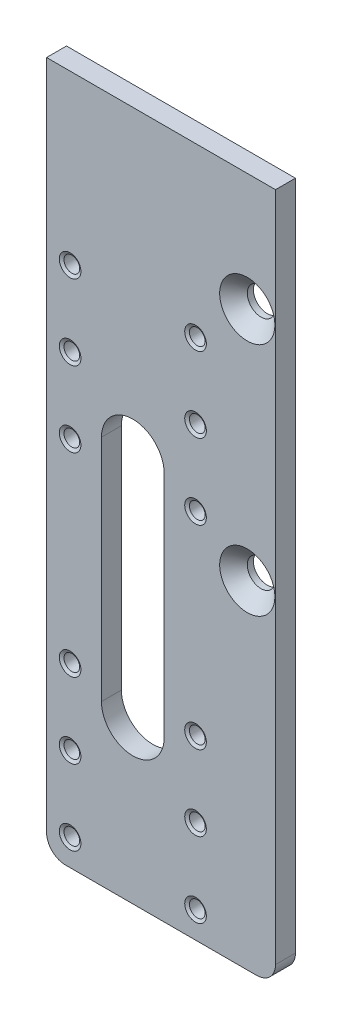
ISO-10303-21;
HEADER;
FILE_DESCRIPTION(('STEP AP214'),'2;1');
FILE_NAME('part.step','',(''),(''),'','','');
FILE_SCHEMA(('AUTOMOTIVE_DESIGN { 1 0 10303 214 1 1 1 1 }'));
ENDSEC;
DATA;
#1=APPLICATION_CONTEXT('core data for automotive mechanical design processes');
#2=APPLICATION_PROTOCOL_DEFINITION('international standard','automotive_design',2000,#1);
#3=PRODUCT_CONTEXT('',#1,'mechanical');
#4=PRODUCT('Part','Part','',(#3));
#5=PRODUCT_RELATED_PRODUCT_CATEGORY('part','',(#4));
#6=PRODUCT_DEFINITION_FORMATION('','',#4);
#7=PRODUCT_DEFINITION_CONTEXT('part definition',#1,'design');
#8=PRODUCT_DEFINITION('design','',#6,#7);
#9=PRODUCT_DEFINITION_SHAPE('','',#8);
#10=(LENGTH_UNIT() NAMED_UNIT(*) SI_UNIT(.MILLI.,.METRE.));
#11=(NAMED_UNIT(*) PLANE_ANGLE_UNIT() SI_UNIT($,.RADIAN.));
#12=(NAMED_UNIT(*) SI_UNIT($,.STERADIAN.) SOLID_ANGLE_UNIT());
#13=UNCERTAINTY_MEASURE_WITH_UNIT(LENGTH_MEASURE(1.E-05),#10,'distance_accuracy_value','');
#14=(GEOMETRIC_REPRESENTATION_CONTEXT(3) GLOBAL_UNCERTAINTY_ASSIGNED_CONTEXT((#13)) GLOBAL_UNIT_ASSIGNED_CONTEXT((#10,
#11,#12)) REPRESENTATION_CONTEXT('',''));
#15=CARTESIAN_POINT('',(0.,0.,0.));
#16=DIRECTION('',(0.,0.,1.));
#17=DIRECTION('',(1.,0.,0.));
#18=AXIS2_PLACEMENT_3D('',#15,#16,#17);
#19=CARTESIAN_POINT('',(-565.816847611489,-465.810072168843,246.750729330131));
#20=DIRECTION('',(0.,0.,1.));
#21=DIRECTION('',(1.,0.,0.));
#22=AXIS2_PLACEMENT_3D('',#19,#20,#21);
#23=CONICAL_SURFACE('',#22,3.44999999985629,1.04719755119663);
#24=CARTESIAN_POINT('',(-565.816847611489,-465.810072168843,246.750729330173));
#25=DIRECTION('',(0.,0.,1.));
#26=DIRECTION('',(1.,0.,0.));
#27=AXIS2_PLACEMENT_3D('',#24,#25,#26);
#28=CIRCLE('',#27,3.44999999992979);
#29=CARTESIAN_POINT('',(-562.366847611559,-465.810072168843,246.750729330173));
#30=VERTEX_POINT('',#29);
#31=EDGE_CURVE('E315',#30,#30,#28,.T.);
#32=ORIENTED_EDGE('',*,*,#31,.T.);
#33=EDGE_LOOP('',(#32));
#34=FACE_BOUND('',#33,.T.);
#35=CARTESIAN_POINT('',(-565.816847611489,-465.810072168843,246.202246574448));
#36=DIRECTION('',(0.,0.,1.));
#37=DIRECTION('',(0.,-1.,0.));
#38=AXIS2_PLACEMENT_3D('',#35,#36,#37);
#39=CIRCLE('',#38,2.5);
#40=CARTESIAN_POINT('',(-565.816847611489,-468.310072168843,246.202246574448));
#41=VERTEX_POINT('',#40);
#42=EDGE_CURVE('E207',#41,#41,#39,.F.);
#43=ORIENTED_EDGE('',*,*,#42,.T.);
#44=EDGE_LOOP('',(#43));
#45=FACE_BOUND('',#44,.T.);
#46=ADVANCED_FACE('F17',(#34,#45),#23,.F.);
#47=CARTESIAN_POINT('',(-525.816847611489,-465.810072168843,246.750729330188));
#48=DIRECTION('',(0.,0.,1.));
#49=DIRECTION('',(0.,-1.,0.));
#50=AXIS2_PLACEMENT_3D('',#47,#48,#49);
#51=CONICAL_SURFACE('',#50,3.44999999994955,1.04719755119663);
#52=CARTESIAN_POINT('',(-525.816847611489,-465.810072168843,246.750729330242));
#53=DIRECTION('',(0.,0.,1.));
#54=DIRECTION('',(0.,-1.,0.));
#55=AXIS2_PLACEMENT_3D('',#52,#53,#54);
#56=CIRCLE('',#55,3.45000000004347);
#57=CARTESIAN_POINT('',(-525.816847611489,-469.260072168886,246.750729330242));
#58=VERTEX_POINT('',#57);
#59=EDGE_CURVE('E323',#58,#58,#56,.T.);
#60=ORIENTED_EDGE('',*,*,#59,.T.);
#61=EDGE_LOOP('',(#60));
#62=FACE_BOUND('',#61,.T.);
#63=CARTESIAN_POINT('',(-525.816847611489,-465.810072168843,246.202246574448));
#64=DIRECTION('',(0.,0.,1.));
#65=DIRECTION('',(0.,-1.,0.));
#66=AXIS2_PLACEMENT_3D('',#63,#64,#65);
#67=CIRCLE('',#66,2.5);
#68=CARTESIAN_POINT('',(-525.816847611489,-468.310072168843,246.202246574448));
#69=VERTEX_POINT('',#68);
#70=EDGE_CURVE('E203',#69,#69,#67,.F.);
#71=ORIENTED_EDGE('',*,*,#70,.T.);
#72=EDGE_LOOP('',(#71));
#73=FACE_BOUND('',#72,.T.);
#74=ADVANCED_FACE('F467',(#62,#73),#51,.F.);
#75=CARTESIAN_POINT('',(-525.816847611489,-489.810072168843,246.750729330188));
#76=DIRECTION('',(0.,0.,1.));
#77=DIRECTION('',(0.,-1.,0.));
#78=AXIS2_PLACEMENT_3D('',#75,#76,#77);
#79=CONICAL_SURFACE('',#78,3.44999999994955,1.04719755119663);
#80=CARTESIAN_POINT('',(-525.816847611489,-489.810072168843,246.750729330242));
#81=DIRECTION('',(0.,0.,1.));
#82=DIRECTION('',(0.,-1.,0.));
#83=AXIS2_PLACEMENT_3D('',#80,#81,#82);
#84=CIRCLE('',#83,3.45000000004347);
#85=CARTESIAN_POINT('',(-525.816847611489,-493.260072168886,246.750729330242));
#86=VERTEX_POINT('',#85);
#87=EDGE_CURVE('E331',#86,#86,#84,.T.);
#88=ORIENTED_EDGE('',*,*,#87,.T.);
#89=EDGE_LOOP('',(#88));
#90=FACE_BOUND('',#89,.T.);
#91=CARTESIAN_POINT('',(-525.816847611489,-489.810072168843,246.202246574448));
#92=DIRECTION('',(0.,0.,1.));
#93=DIRECTION('',(0.,-1.,0.));
#94=AXIS2_PLACEMENT_3D('',#91,#92,#93);
#95=CIRCLE('',#94,2.5);
#96=CARTESIAN_POINT('',(-525.816847611489,-492.310072168843,246.202246574448));
#97=VERTEX_POINT('',#96);
#98=EDGE_CURVE('E199',#97,#97,#95,.F.);
#99=ORIENTED_EDGE('',*,*,#98,.T.);
#100=EDGE_LOOP('',(#99));
#101=FACE_BOUND('',#100,.T.);
#102=ADVANCED_FACE('F471',(#90,#101),#79,.F.);
#103=CARTESIAN_POINT('',(-525.816847611489,-355.810072168843,246.750729330188));
#104=DIRECTION('',(0.,0.,1.));
#105=DIRECTION('',(0.,-1.,0.));
#106=AXIS2_PLACEMENT_3D('',#103,#104,#105);
#107=CONICAL_SURFACE('',#106,3.44999999994955,1.04719755119663);
#108=CARTESIAN_POINT('',(-525.816847611489,-355.810072168843,246.750729330242));
#109=DIRECTION('',(0.,0.,1.));
#110=DIRECTION('',(0.,-1.,0.));
#111=AXIS2_PLACEMENT_3D('',#108,#109,#110);
#112=CIRCLE('',#111,3.45000000004347);
#113=CARTESIAN_POINT('',(-525.816847611489,-359.260072168886,246.750729330242));
#114=VERTEX_POINT('',#113);
#115=EDGE_CURVE('E20',#114,#114,#112,.T.);
#116=ORIENTED_EDGE('',*,*,#115,.T.);
#117=EDGE_LOOP('',(#116));
#118=FACE_BOUND('',#117,.T.);
#119=CARTESIAN_POINT('',(-525.816847611489,-355.810072168843,246.202246574448));
#120=DIRECTION('',(0.,0.,1.));
#121=DIRECTION('',(0.,-1.,0.));
#122=AXIS2_PLACEMENT_3D('',#119,#120,#121);
#123=CIRCLE('',#122,2.5);
#124=CARTESIAN_POINT('',(-525.816847611489,-358.310072168843,246.202246574448));
#125=VERTEX_POINT('',#124);
#126=EDGE_CURVE('E195',#125,#125,#123,.F.);
#127=ORIENTED_EDGE('',*,*,#126,.T.);
#128=EDGE_LOOP('',(#127));
#129=FACE_BOUND('',#128,.T.);
#130=ADVANCED_FACE('F345',(#118,#129),#107,.F.);
#131=CARTESIAN_POINT('',(-525.816847611489,-379.810072168843,246.750729330188));
#132=DIRECTION('',(0.,0.,1.));
#133=DIRECTION('',(0.,-1.,0.));
#134=AXIS2_PLACEMENT_3D('',#131,#132,#133);
#135=CONICAL_SURFACE('',#134,3.44999999994955,1.04719755119663);
#136=CARTESIAN_POINT('',(-525.816847611489,-379.810072168843,246.750729330242));
#137=DIRECTION('',(0.,0.,1.));
#138=DIRECTION('',(0.,-1.,0.));
#139=AXIS2_PLACEMENT_3D('',#136,#137,#138);
#140=CIRCLE('',#139,3.45000000004347);
#141=CARTESIAN_POINT('',(-525.816847611489,-383.260072168886,246.750729330242));
#142=VERTEX_POINT('',#141);
#143=EDGE_CURVE('E303',#142,#142,#140,.T.);
#144=ORIENTED_EDGE('',*,*,#143,.T.);
#145=EDGE_LOOP('',(#144));
#146=FACE_BOUND('',#145,.T.);
#147=CARTESIAN_POINT('',(-525.816847611489,-379.810072168843,246.202246574448));
#148=DIRECTION('',(0.,0.,1.));
#149=DIRECTION('',(0.,-1.,0.));
#150=AXIS2_PLACEMENT_3D('',#147,#148,#149);
#151=CIRCLE('',#150,2.5);
#152=CARTESIAN_POINT('',(-525.816847611489,-382.310072168843,246.202246574448));
#153=VERTEX_POINT('',#152);
#154=EDGE_CURVE('E191',#153,#153,#151,.F.);
#155=ORIENTED_EDGE('',*,*,#154,.T.);
#156=EDGE_LOOP('',(#155));
#157=FACE_BOUND('',#156,.T.);
#158=ADVANCED_FACE('F497',(#146,#157),#135,.F.);
#159=CARTESIAN_POINT('',(-525.816847611489,-403.810072168843,246.750729330188));
#160=DIRECTION('',(0.,0.,1.));
#161=DIRECTION('',(0.,-1.,0.));
#162=AXIS2_PLACEMENT_3D('',#159,#160,#161);
#163=CONICAL_SURFACE('',#162,3.44999999994955,1.04719755119663);
#164=CARTESIAN_POINT('',(-525.816847611489,-403.810072168843,246.750729330242));
#165=DIRECTION('',(0.,0.,1.));
#166=DIRECTION('',(0.,-1.,0.));
#167=AXIS2_PLACEMENT_3D('',#164,#165,#166);
#168=CIRCLE('',#167,3.45000000004347);
#169=CARTESIAN_POINT('',(-525.816847611489,-407.260072168886,246.750729330242));
#170=VERTEX_POINT('',#169);
#171=EDGE_CURVE('E319',#170,#170,#168,.T.);
#172=ORIENTED_EDGE('',*,*,#171,.T.);
#173=EDGE_LOOP('',(#172));
#174=FACE_BOUND('',#173,.T.);
#175=CARTESIAN_POINT('',(-525.816847611489,-403.810072168843,246.202246574448));
#176=DIRECTION('',(0.,0.,1.));
#177=DIRECTION('',(0.,-1.,0.));
#178=AXIS2_PLACEMENT_3D('',#175,#176,#177);
#179=CIRCLE('',#178,2.5);
#180=CARTESIAN_POINT('',(-525.816847611489,-406.310072168843,246.202246574448));
#181=VERTEX_POINT('',#180);
#182=EDGE_CURVE('E187',#181,#181,#179,.F.);
#183=ORIENTED_EDGE('',*,*,#182,.T.);
#184=EDGE_LOOP('',(#183));
#185=FACE_BOUND('',#184,.T.);
#186=ADVANCED_FACE('F502',(#174,#185),#163,.F.);
#187=CARTESIAN_POINT('',(-565.816847611489,-355.810072168843,246.750729330131));
#188=DIRECTION('',(0.,0.,1.));
#189=DIRECTION('',(1.,0.,0.));
#190=AXIS2_PLACEMENT_3D('',#187,#188,#189);
#191=CONICAL_SURFACE('',#190,3.44999999985629,1.04719755119663);
#192=CARTESIAN_POINT('',(-565.816847611489,-355.810072168843,246.750729330173));
#193=DIRECTION('',(0.,0.,1.));
#194=DIRECTION('',(1.,0.,0.));
#195=AXIS2_PLACEMENT_3D('',#192,#193,#194);
#196=CIRCLE('',#195,3.44999999992979);
#197=CARTESIAN_POINT('',(-562.366847611559,-355.810072168843,246.750729330173));
#198=VERTEX_POINT('',#197);
#199=EDGE_CURVE('E334',#198,#198,#196,.T.);
#200=ORIENTED_EDGE('',*,*,#199,.T.);
#201=EDGE_LOOP('',(#200));
#202=FACE_BOUND('',#201,.T.);
#203=CARTESIAN_POINT('',(-565.816847611489,-355.810072168843,246.202246574448));
#204=DIRECTION('',(0.,0.,1.));
#205=DIRECTION('',(0.,-1.,0.));
#206=AXIS2_PLACEMENT_3D('',#203,#204,#205);
#207=CIRCLE('',#206,2.5);
#208=CARTESIAN_POINT('',(-565.816847611489,-358.310072168843,246.202246574448));
#209=VERTEX_POINT('',#208);
#210=EDGE_CURVE('E183',#209,#209,#207,.F.);
#211=ORIENTED_EDGE('',*,*,#210,.T.);
#212=EDGE_LOOP('',(#211));
#213=FACE_BOUND('',#212,.T.);
#214=ADVANCED_FACE('F506',(#202,#213),#191,.F.);
#215=CARTESIAN_POINT('',(-565.816847611489,-379.810072168843,246.750729330131));
#216=DIRECTION('',(0.,0.,1.));
#217=DIRECTION('',(1.,0.,0.));
#218=AXIS2_PLACEMENT_3D('',#215,#216,#217);
#219=CONICAL_SURFACE('',#218,3.44999999985629,1.04719755119663);
#220=CARTESIAN_POINT('',(-565.816847611489,-379.810072168843,246.750729330173));
#221=DIRECTION('',(0.,0.,1.));
#222=DIRECTION('',(1.,0.,0.));
#223=AXIS2_PLACEMENT_3D('',#220,#221,#222);
#224=CIRCLE('',#223,3.44999999992979);
#225=CARTESIAN_POINT('',(-562.366847611559,-379.810072168843,246.750729330173));
#226=VERTEX_POINT('',#225);
#227=EDGE_CURVE('E311',#226,#226,#224,.T.);
#228=ORIENTED_EDGE('',*,*,#227,.T.);
#229=EDGE_LOOP('',(#228));
#230=FACE_BOUND('',#229,.T.);
#231=CARTESIAN_POINT('',(-565.816847611489,-379.810072168843,246.202246574448));
#232=DIRECTION('',(0.,0.,1.));
#233=DIRECTION('',(0.,-1.,0.));
#234=AXIS2_PLACEMENT_3D('',#231,#232,#233);
#235=CIRCLE('',#234,2.5);
#236=CARTESIAN_POINT('',(-565.816847611489,-382.310072168843,246.202246574448));
#237=VERTEX_POINT('',#236);
#238=EDGE_CURVE('E179',#237,#237,#235,.F.);
#239=ORIENTED_EDGE('',*,*,#238,.T.);
#240=EDGE_LOOP('',(#239));
#241=FACE_BOUND('',#240,.T.);
#242=ADVANCED_FACE('F510',(#230,#241),#219,.F.);
#243=CARTESIAN_POINT('',(-565.816847611489,-403.810072168843,246.750729330131));
#244=DIRECTION('',(0.,0.,1.));
#245=DIRECTION('',(1.,0.,0.));
#246=AXIS2_PLACEMENT_3D('',#243,#244,#245);
#247=CONICAL_SURFACE('',#246,3.44999999985629,1.04719755119663);
#248=CARTESIAN_POINT('',(-565.816847611489,-403.810072168843,246.750729330173));
#249=DIRECTION('',(0.,0.,1.));
#250=DIRECTION('',(1.,0.,0.));
#251=AXIS2_PLACEMENT_3D('',#248,#249,#250);
#252=CIRCLE('',#251,3.44999999992979);
#253=CARTESIAN_POINT('',(-562.366847611559,-403.810072168843,246.750729330173));
#254=VERTEX_POINT('',#253);
#255=EDGE_CURVE('E327',#254,#254,#252,.T.);
#256=ORIENTED_EDGE('',*,*,#255,.T.);
#257=EDGE_LOOP('',(#256));
#258=FACE_BOUND('',#257,.T.);
#259=CARTESIAN_POINT('',(-565.816847611489,-403.810072168843,246.202246574448));
#260=DIRECTION('',(0.,0.,1.));
#261=DIRECTION('',(0.,-1.,0.));
#262=AXIS2_PLACEMENT_3D('',#259,#260,#261);
#263=CIRCLE('',#262,2.5);
#264=CARTESIAN_POINT('',(-565.816847611489,-406.310072168843,246.202246574448));
#265=VERTEX_POINT('',#264);
#266=EDGE_CURVE('E100',#265,#265,#263,.F.);
#267=ORIENTED_EDGE('',*,*,#266,.T.);
#268=EDGE_LOOP('',(#267));
#269=FACE_BOUND('',#268,.T.);
#270=ADVANCED_FACE('F513',(#258,#269),#247,.F.);
#271=CARTESIAN_POINT('',(-565.816847611489,-513.810072168843,246.750729330131));
#272=DIRECTION('',(0.,0.,1.));
#273=DIRECTION('',(1.,0.,0.));
#274=AXIS2_PLACEMENT_3D('',#271,#272,#273);
#275=CONICAL_SURFACE('',#274,3.44999999985629,1.04719755119663);
#276=CARTESIAN_POINT('',(-565.816847611489,-513.810072168843,246.750729330173));
#277=DIRECTION('',(0.,0.,1.));
#278=DIRECTION('',(1.,0.,0.));
#279=AXIS2_PLACEMENT_3D('',#276,#277,#278);
#280=CIRCLE('',#279,3.44999999992979);
#281=CARTESIAN_POINT('',(-562.366847611559,-513.810072168843,246.750729330173));
#282=VERTEX_POINT('',#281);
#283=EDGE_CURVE('E291',#282,#282,#280,.T.);
#284=ORIENTED_EDGE('',*,*,#283,.T.);
#285=EDGE_LOOP('',(#284));
#286=FACE_BOUND('',#285,.T.);
#287=CARTESIAN_POINT('',(-565.816847611489,-513.810072168843,246.202246574448));
#288=DIRECTION('',(0.,0.,1.));
#289=DIRECTION('',(0.,-1.,0.));
#290=AXIS2_PLACEMENT_3D('',#287,#288,#289);
#291=CIRCLE('',#290,2.5);
#292=CARTESIAN_POINT('',(-565.816847611489,-516.310072168843,246.202246574448));
#293=VERTEX_POINT('',#292);
#294=EDGE_CURVE('E169',#293,#293,#291,.F.);
#295=ORIENTED_EDGE('',*,*,#294,.T.);
#296=EDGE_LOOP('',(#295));
#297=FACE_BOUND('',#296,.T.);
#298=ADVANCED_FACE('F517',(#286,#297),#275,.F.);
#299=CARTESIAN_POINT('',(-525.816847611489,-513.810072168843,246.750729330188));
#300=DIRECTION('',(0.,0.,1.));
#301=DIRECTION('',(0.,-1.,0.));
#302=AXIS2_PLACEMENT_3D('',#299,#300,#301);
#303=CONICAL_SURFACE('',#302,3.44999999994955,1.04719755119663);
#304=CARTESIAN_POINT('',(-525.816847611489,-513.810072168843,246.750729330242));
#305=DIRECTION('',(0.,0.,1.));
#306=DIRECTION('',(0.,-1.,0.));
#307=AXIS2_PLACEMENT_3D('',#304,#305,#306);
#308=CIRCLE('',#307,3.45000000004347);
#309=CARTESIAN_POINT('',(-525.816847611489,-517.260072168886,246.750729330242));
#310=VERTEX_POINT('',#309);
#311=EDGE_CURVE('E295',#310,#310,#308,.T.);
#312=ORIENTED_EDGE('',*,*,#311,.T.);
#313=EDGE_LOOP('',(#312));
#314=FACE_BOUND('',#313,.T.);
#315=CARTESIAN_POINT('',(-525.816847611489,-513.810072168843,246.202246574448));
#316=DIRECTION('',(0.,0.,1.));
#317=DIRECTION('',(0.,-1.,0.));
#318=AXIS2_PLACEMENT_3D('',#315,#316,#317);
#319=CIRCLE('',#318,2.5);
#320=CARTESIAN_POINT('',(-525.816847611489,-516.310072168843,246.202246574448));
#321=VERTEX_POINT('',#320);
#322=EDGE_CURVE('E165',#321,#321,#319,.F.);
#323=ORIENTED_EDGE('',*,*,#322,.T.);
#324=EDGE_LOOP('',(#323));
#325=FACE_BOUND('',#324,.T.);
#326=ADVANCED_FACE('F521',(#314,#325),#303,.F.);
#327=CARTESIAN_POINT('',(-509.316847611489,-339.701572168842,246.750729330131));
#328=DIRECTION('',(0.,0.,1.));
#329=DIRECTION('',(1.,0.,0.));
#330=AXIS2_PLACEMENT_3D('',#327,#328,#329);
#331=CONICAL_SURFACE('',#330,8.79999999990633,0.785398163397448);
#332=CARTESIAN_POINT('',(-509.316847611489,-339.701572168842,246.750729330188));
#333=DIRECTION('',(0.,0.,1.));
#334=DIRECTION('',(1.,0.,0.));
#335=AXIS2_PLACEMENT_3D('',#332,#333,#334);
#336=CIRCLE('',#335,8.79999999996317);
#337=CARTESIAN_POINT('',(-500.516847611526,-339.701572168842,246.750729330188));
#338=VERTEX_POINT('',#337);
#339=EDGE_CURVE('E299',#338,#338,#336,.T.);
#340=ORIENTED_EDGE('',*,*,#339,.T.);
#341=EDGE_LOOP('',(#340));
#342=FACE_BOUND('',#341,.T.);
#343=CARTESIAN_POINT('',(-509.316847611489,-339.701572168842,242.350729330178));
#344=DIRECTION('',(0.,0.,1.));
#345=DIRECTION('',(0.,-1.,0.));
#346=AXIS2_PLACEMENT_3D('',#343,#344,#345);
#347=CIRCLE('',#346,4.4);
#348=CARTESIAN_POINT('',(-509.316847611489,-344.101572168842,242.350729330178));
#349=VERTEX_POINT('',#348);
#350=EDGE_CURVE('E161',#349,#349,#347,.F.);
#351=ORIENTED_EDGE('',*,*,#350,.T.);
#352=EDGE_LOOP('',(#351));
#353=FACE_BOUND('',#352,.T.);
#354=ADVANCED_FACE('F359',(#342,#353),#331,.F.);
#355=CARTESIAN_POINT('',(-565.816847611489,-489.810072168843,246.750729330131));
#356=DIRECTION('',(0.,0.,1.));
#357=DIRECTION('',(1.,0.,0.));
#358=AXIS2_PLACEMENT_3D('',#355,#356,#357);
#359=CONICAL_SURFACE('',#358,3.44999999985629,1.04719755119663);
#360=CARTESIAN_POINT('',(-565.816847611489,-489.810072168843,246.750729330173));
#361=DIRECTION('',(0.,0.,1.));
#362=DIRECTION('',(1.,0.,0.));
#363=AXIS2_PLACEMENT_3D('',#360,#361,#362);
#364=CIRCLE('',#363,3.44999999992979);
#365=CARTESIAN_POINT('',(-562.366847611559,-489.810072168843,246.750729330173));
#366=VERTEX_POINT('',#365);
#367=EDGE_CURVE('E307',#366,#366,#364,.T.);
#368=ORIENTED_EDGE('',*,*,#367,.T.);
#369=EDGE_LOOP('',(#368));
#370=FACE_BOUND('',#369,.T.);
#371=CARTESIAN_POINT('',(-565.816847611489,-489.810072168843,246.202246574448));
#372=DIRECTION('',(0.,0.,1.));
#373=DIRECTION('',(0.,-1.,0.));
#374=AXIS2_PLACEMENT_3D('',#371,#372,#373);
#375=CIRCLE('',#374,2.5);
#376=CARTESIAN_POINT('',(-565.816847611489,-492.310072168843,246.202246574448));
#377=VERTEX_POINT('',#376);
#378=EDGE_CURVE('E142',#377,#377,#375,.F.);
#379=ORIENTED_EDGE('',*,*,#378,.T.);
#380=EDGE_LOOP('',(#379));
#381=FACE_BOUND('',#380,.T.);
#382=ADVANCED_FACE('F349',(#370,#381),#359,.F.);
#383=CARTESIAN_POINT('',(-564.566847611488,-458.810072168843,246.750729330178));
#384=DIRECTION('',(0.,0.,-1.));
#385=DIRECTION('',(0.,1.,0.));
#386=AXIS2_PLACEMENT_3D('',#383,#384,#385);
#387=PLANE('',#386);
#388=DIRECTION('',(-1.,0.,0.));
#389=VECTOR('',#388,1.);
#390=CARTESIAN_POINT('',(-588.489347611488,-302.201572168842,246.750729330178));
#391=LINE('',#390,#389);
#392=CARTESIAN_POINT('',(-573.316847611489,-302.201572168842,246.750729330178));
#393=VERTEX_POINT('',#392);
#394=CARTESIAN_POINT('',(-500.316847611489,-302.201572168842,246.750729330178));
#395=VERTEX_POINT('',#394);
#396=EDGE_CURVE('E143',#393,#395,#391,.F.);
#397=ORIENTED_EDGE('',*,*,#396,.F.);
#398=DIRECTION('',(0.,1.,0.));
#399=VECTOR('',#398,1.);
#400=CARTESIAN_POINT('',(-573.316847611489,-346.310072168843,246.750729330178));
#401=LINE('',#400,#399);
#402=CARTESIAN_POINT('',(-573.316847611489,-516.201572168843,246.750729330178));
#403=VERTEX_POINT('',#402);
#404=EDGE_CURVE('E151',#403,#393,#401,.T.);
#405=ORIENTED_EDGE('',*,*,#404,.F.);
#406=CARTESIAN_POINT('',(-567.316847611489,-516.201572168843,246.750729330178));
#407=DIRECTION('',(0.,0.,1.));
#408=DIRECTION('',(1.,0.,0.));
#409=AXIS2_PLACEMENT_3D('',#406,#407,#408);
#410=CIRCLE('',#409,6.);
#411=CARTESIAN_POINT('',(-567.316847611489,-522.201572168843,246.750729330178));
#412=VERTEX_POINT('',#411);
#413=EDGE_CURVE('E155',#412,#403,#410,.F.);
#414=ORIENTED_EDGE('',*,*,#413,.F.);
#415=DIRECTION('',(-1.,0.,0.));
#416=VECTOR('',#415,1.);
#417=CARTESIAN_POINT('',(-588.489347611488,-522.201572168843,246.750729330178));
#418=LINE('',#417,#416);
#419=CARTESIAN_POINT('',(-506.316847611489,-522.201572168843,246.750729330178));
#420=VERTEX_POINT('',#419);
#421=EDGE_CURVE('E138',#412,#420,#418,.F.);
#422=ORIENTED_EDGE('',*,*,#421,.T.);
#423=CARTESIAN_POINT('',(-506.316847611489,-516.201572168843,246.750729330178));
#424=DIRECTION('',(0.,0.,1.));
#425=DIRECTION('',(1.,0.,0.));
#426=AXIS2_PLACEMENT_3D('',#423,#424,#425);
#427=CIRCLE('',#426,6.);
#428=CARTESIAN_POINT('',(-500.316847611489,-516.201572168843,246.750729330178));
#429=VERTEX_POINT('',#428);
#430=EDGE_CURVE('E129',#429,#420,#427,.F.);
#431=ORIENTED_EDGE('',*,*,#430,.F.);
#432=DIRECTION('',(0.,-1.,0.));
#433=VECTOR('',#432,1.);
#434=CARTESIAN_POINT('',(-500.316847611489,-398.310072168843,246.750729330178));
#435=LINE('',#434,#433);
#436=EDGE_CURVE('E130',#429,#395,#435,.F.);
#437=ORIENTED_EDGE('',*,*,#436,.T.);
#438=EDGE_LOOP('',(#397,#405,#414,#422,#431,#437));
#439=FACE_BOUND('',#438,.T.);
#440=ORIENTED_EDGE('',*,*,#283,.F.);
#441=EDGE_LOOP('',(#440));
#442=FACE_BOUND('',#441,.T.);
#443=CARTESIAN_POINT('',(-509.316847611489,-414.701572168842,246.750729330188));
#444=DIRECTION('',(0.,0.,1.));
#445=DIRECTION('',(1.,0.,0.));
#446=AXIS2_PLACEMENT_3D('',#443,#444,#445);
#447=CIRCLE('',#446,8.79999999996317);
#448=CARTESIAN_POINT('',(-500.516847611526,-414.701572168842,246.750729330188));
#449=VERTEX_POINT('',#448);
#450=EDGE_CURVE('E210',#449,#449,#447,.F.);
#451=ORIENTED_EDGE('',*,*,#450,.T.);
#452=EDGE_LOOP('',(#451));
#453=FACE_BOUND('',#452,.T.);
#454=ORIENTED_EDGE('',*,*,#311,.F.);
#455=EDGE_LOOP('',(#454));
#456=FACE_BOUND('',#455,.T.);
#457=ORIENTED_EDGE('',*,*,#339,.F.);
#458=EDGE_LOOP('',(#457));
#459=FACE_BOUND('',#458,.T.);
#460=ORIENTED_EDGE('',*,*,#143,.F.);
#461=EDGE_LOOP('',(#460));
#462=FACE_BOUND('',#461,.T.);
#463=ORIENTED_EDGE('',*,*,#367,.F.);
#464=EDGE_LOOP('',(#463));
#465=FACE_BOUND('',#464,.T.);
#466=ORIENTED_EDGE('',*,*,#227,.F.);
#467=EDGE_LOOP('',(#466));
#468=FACE_BOUND('',#467,.T.);
#469=ORIENTED_EDGE('',*,*,#31,.F.);
#470=EDGE_LOOP('',(#469));
#471=FACE_BOUND('',#470,.T.);
#472=ORIENTED_EDGE('',*,*,#171,.F.);
#473=EDGE_LOOP('',(#472));
#474=FACE_BOUND('',#473,.T.);
#475=ORIENTED_EDGE('',*,*,#59,.F.);
#476=EDGE_LOOP('',(#475));
#477=FACE_BOUND('',#476,.T.);
#478=ORIENTED_EDGE('',*,*,#255,.F.);
#479=EDGE_LOOP('',(#478));
#480=FACE_BOUND('',#479,.T.);
#481=ORIENTED_EDGE('',*,*,#87,.F.);
#482=EDGE_LOOP('',(#481));
#483=FACE_BOUND('',#482,.T.);
#484=ORIENTED_EDGE('',*,*,#199,.F.);
#485=EDGE_LOOP('',(#484));
#486=FACE_BOUND('',#485,.T.);
#487=CARTESIAN_POINT('',(-545.816847611489,-398.310072168843,246.750729330178));
#488=DIRECTION('',(0.,0.,1.));
#489=DIRECTION('',(0.,-1.,0.));
#490=AXIS2_PLACEMENT_3D('',#487,#488,#489);
#491=CIRCLE('',#490,10.);
#492=CARTESIAN_POINT('',(-555.816847611489,-398.310072168843,246.750729330178));
#493=VERTEX_POINT('',#492);
#494=CARTESIAN_POINT('',(-535.816847611489,-398.310072168843,246.750729330178));
#495=VERTEX_POINT('',#494);
#496=EDGE_CURVE('E88',#493,#495,#491,.F.);
#497=ORIENTED_EDGE('',*,*,#496,.T.);
#498=DIRECTION('',(0.,1.,0.));
#499=VECTOR('',#498,1.);
#500=CARTESIAN_POINT('',(-535.816847611489,-398.310072168843,246.750729330178));
#501=LINE('',#500,#499);
#502=CARTESIAN_POINT('',(-535.816847611489,-471.310072168843,246.750729330178));
#503=VERTEX_POINT('',#502);
#504=EDGE_CURVE('E173',#495,#503,#501,.F.);
#505=ORIENTED_EDGE('',*,*,#504,.T.);
#506=CARTESIAN_POINT('',(-545.816847611489,-471.310072168843,246.750729330178));
#507=DIRECTION('',(0.,0.,1.));
#508=DIRECTION('',(0.,-1.,0.));
#509=AXIS2_PLACEMENT_3D('',#506,#507,#508);
#510=CIRCLE('',#509,10.);
#511=CARTESIAN_POINT('',(-555.816847611489,-471.310072168843,246.750729330178));
#512=VERTEX_POINT('',#511);
#513=EDGE_CURVE('E106',#503,#512,#510,.F.);
#514=ORIENTED_EDGE('',*,*,#513,.T.);
#515=DIRECTION('',(0.,1.,0.));
#516=VECTOR('',#515,1.);
#517=CARTESIAN_POINT('',(-555.816847611489,-471.310072168843,246.750729330178));
#518=LINE('',#517,#516);
#519=EDGE_CURVE('E103',#512,#493,#518,.T.);
#520=ORIENTED_EDGE('',*,*,#519,.T.);
#521=EDGE_LOOP('',(#497,#505,#514,#520));
#522=FACE_BOUND('',#521,.T.);
#523=ORIENTED_EDGE('',*,*,#115,.F.);
#524=EDGE_LOOP('',(#523));
#525=FACE_BOUND('',#524,.T.);
#526=ADVANCED_FACE('F104',(#439,#442,#453,#456,#459,#462,#465,#468,#471,#474,#477,#480,#483,
#486,#522,#525),#387,.F.);
#527=CARTESIAN_POINT('',(-509.316847611489,-414.701572168842,246.750729330131));
#528=DIRECTION('',(0.,0.,1.));
#529=DIRECTION('',(1.,0.,0.));
#530=AXIS2_PLACEMENT_3D('',#527,#528,#529);
#531=CONICAL_SURFACE('',#530,8.79999999990633,0.785398163397448);
#532=ORIENTED_EDGE('',*,*,#450,.F.);
#533=EDGE_LOOP('',(#532));
#534=FACE_BOUND('',#533,.T.);
#535=CARTESIAN_POINT('',(-509.316847611489,-414.701572168842,242.350729330178));
#536=DIRECTION('',(0.,0.,1.));
#537=DIRECTION('',(0.,-1.,0.));
#538=AXIS2_PLACEMENT_3D('',#535,#536,#537);
#539=CIRCLE('',#538,4.4);
#540=CARTESIAN_POINT('',(-509.316847611489,-419.101572168842,242.350729330178));
#541=VERTEX_POINT('',#540);
#542=EDGE_CURVE('E124',#541,#541,#539,.F.);
#543=ORIENTED_EDGE('',*,*,#542,.T.);
#544=EDGE_LOOP('',(#543));
#545=FACE_BOUND('',#544,.T.);
#546=ADVANCED_FACE('F348',(#534,#545),#531,.F.);
#547=CARTESIAN_POINT('',(-565.816847611489,-465.810072168843,246.750729330178));
#548=DIRECTION('',(0.,0.,1.));
#549=DIRECTION('',(0.,-1.,0.));
#550=AXIS2_PLACEMENT_3D('',#547,#548,#549);
#551=CYLINDRICAL_SURFACE('',#550,2.5);
#552=ORIENTED_EDGE('',*,*,#42,.F.);
#553=EDGE_LOOP('',(#552));
#554=FACE_BOUND('',#553,.T.);
#555=CARTESIAN_POINT('',(-565.816847611489,-465.810072168843,240.400729330178));
#556=DIRECTION('',(0.,0.,1.));
#557=DIRECTION('',(0.,-1.,0.));
#558=AXIS2_PLACEMENT_3D('',#555,#556,#557);
#559=CIRCLE('',#558,2.5);
#560=CARTESIAN_POINT('',(-565.816847611489,-468.310072168843,240.400729330178));
#561=VERTEX_POINT('',#560);
#562=EDGE_CURVE('E128',#561,#561,#559,.T.);
#563=ORIENTED_EDGE('',*,*,#562,.F.);
#564=EDGE_LOOP('',(#563));
#565=FACE_BOUND('',#564,.T.);
#566=ADVANCED_FACE('F356',(#554,#565),#551,.F.);
#567=CARTESIAN_POINT('',(-525.816847611489,-465.810072168843,246.750729330178));
#568=DIRECTION('',(0.,0.,1.));
#569=DIRECTION('',(0.,-1.,0.));
#570=AXIS2_PLACEMENT_3D('',#567,#568,#569);
#571=CYLINDRICAL_SURFACE('',#570,2.5);
#572=ORIENTED_EDGE('',*,*,#70,.F.);
#573=EDGE_LOOP('',(#572));
#574=FACE_BOUND('',#573,.T.);
#575=CARTESIAN_POINT('',(-525.816847611489,-465.810072168843,240.400729330178));
#576=DIRECTION('',(0.,0.,1.));
#577=DIRECTION('',(0.,-1.,0.));
#578=AXIS2_PLACEMENT_3D('',#575,#576,#577);
#579=CIRCLE('',#578,2.5);
#580=CARTESIAN_POINT('',(-525.816847611489,-468.310072168843,240.400729330178));
#581=VERTEX_POINT('',#580);
#582=EDGE_CURVE('E273',#581,#581,#579,.T.);
#583=ORIENTED_EDGE('',*,*,#582,.F.);
#584=EDGE_LOOP('',(#583));
#585=FACE_BOUND('',#584,.T.);
#586=ADVANCED_FACE('F453',(#574,#585),#571,.F.);
#587=CARTESIAN_POINT('',(-525.816847611489,-489.810072168843,246.750729330178));
#588=DIRECTION('',(0.,0.,1.));
#589=DIRECTION('',(0.,-1.,0.));
#590=AXIS2_PLACEMENT_3D('',#587,#588,#589);
#591=CYLINDRICAL_SURFACE('',#590,2.5);
#592=ORIENTED_EDGE('',*,*,#98,.F.);
#593=EDGE_LOOP('',(#592));
#594=FACE_BOUND('',#593,.T.);
#595=CARTESIAN_POINT('',(-525.816847611489,-489.810072168843,240.400729330178));
#596=DIRECTION('',(0.,0.,1.));
#597=DIRECTION('',(0.,-1.,0.));
#598=AXIS2_PLACEMENT_3D('',#595,#596,#597);
#599=CIRCLE('',#598,2.5);
#600=CARTESIAN_POINT('',(-525.816847611489,-492.310072168843,240.400729330178));
#601=VERTEX_POINT('',#600);
#602=EDGE_CURVE('E269',#601,#601,#599,.T.);
#603=ORIENTED_EDGE('',*,*,#602,.F.);
#604=EDGE_LOOP('',(#603));
#605=FACE_BOUND('',#604,.T.);
#606=ADVANCED_FACE('F449',(#594,#605),#591,.F.);
#607=CARTESIAN_POINT('',(-525.816847611489,-355.810072168843,246.750729330178));
#608=DIRECTION('',(0.,0.,1.));
#609=DIRECTION('',(0.,-1.,0.));
#610=AXIS2_PLACEMENT_3D('',#607,#608,#609);
#611=CYLINDRICAL_SURFACE('',#610,2.5);
#612=ORIENTED_EDGE('',*,*,#126,.F.);
#613=EDGE_LOOP('',(#612));
#614=FACE_BOUND('',#613,.T.);
#615=CARTESIAN_POINT('',(-525.816847611489,-355.810072168843,240.400729330178));
#616=DIRECTION('',(0.,0.,1.));
#617=DIRECTION('',(0.,-1.,0.));
#618=AXIS2_PLACEMENT_3D('',#615,#616,#617);
#619=CIRCLE('',#618,2.5);
#620=CARTESIAN_POINT('',(-525.816847611489,-358.310072168843,240.400729330178));
#621=VERTEX_POINT('',#620);
#622=EDGE_CURVE('E265',#621,#621,#619,.T.);
#623=ORIENTED_EDGE('',*,*,#622,.F.);
#624=EDGE_LOOP('',(#623));
#625=FACE_BOUND('',#624,.T.);
#626=ADVANCED_FACE('F445',(#614,#625),#611,.F.);
#627=CARTESIAN_POINT('',(-525.816847611489,-379.810072168843,246.750729330178));
#628=DIRECTION('',(0.,0.,1.));
#629=DIRECTION('',(0.,-1.,0.));
#630=AXIS2_PLACEMENT_3D('',#627,#628,#629);
#631=CYLINDRICAL_SURFACE('',#630,2.5);
#632=ORIENTED_EDGE('',*,*,#154,.F.);
#633=EDGE_LOOP('',(#632));
#634=FACE_BOUND('',#633,.T.);
#635=CARTESIAN_POINT('',(-525.816847611489,-379.810072168843,240.400729330178));
#636=DIRECTION('',(0.,0.,1.));
#637=DIRECTION('',(0.,-1.,0.));
#638=AXIS2_PLACEMENT_3D('',#635,#636,#637);
#639=CIRCLE('',#638,2.5);
#640=CARTESIAN_POINT('',(-525.816847611489,-382.310072168843,240.400729330178));
#641=VERTEX_POINT('',#640);
#642=EDGE_CURVE('E261',#641,#641,#639,.T.);
#643=ORIENTED_EDGE('',*,*,#642,.F.);
#644=EDGE_LOOP('',(#643));
#645=FACE_BOUND('',#644,.T.);
#646=ADVANCED_FACE('F441',(#634,#645),#631,.F.);
#647=CARTESIAN_POINT('',(-525.816847611489,-403.810072168843,246.750729330178));
#648=DIRECTION('',(0.,0.,1.));
#649=DIRECTION('',(0.,-1.,0.));
#650=AXIS2_PLACEMENT_3D('',#647,#648,#649);
#651=CYLINDRICAL_SURFACE('',#650,2.5);
#652=ORIENTED_EDGE('',*,*,#182,.F.);
#653=EDGE_LOOP('',(#652));
#654=FACE_BOUND('',#653,.T.);
#655=CARTESIAN_POINT('',(-525.816847611489,-403.810072168843,240.400729330178));
#656=DIRECTION('',(0.,0.,1.));
#657=DIRECTION('',(0.,-1.,0.));
#658=AXIS2_PLACEMENT_3D('',#655,#656,#657);
#659=CIRCLE('',#658,2.5);
#660=CARTESIAN_POINT('',(-525.816847611489,-406.310072168843,240.400729330178));
#661=VERTEX_POINT('',#660);
#662=EDGE_CURVE('E257',#661,#661,#659,.T.);
#663=ORIENTED_EDGE('',*,*,#662,.F.);
#664=EDGE_LOOP('',(#663));
#665=FACE_BOUND('',#664,.T.);
#666=ADVANCED_FACE('F437',(#654,#665),#651,.F.);
#667=CARTESIAN_POINT('',(-565.816847611489,-355.810072168843,246.750729330178));
#668=DIRECTION('',(0.,0.,1.));
#669=DIRECTION('',(0.,-1.,0.));
#670=AXIS2_PLACEMENT_3D('',#667,#668,#669);
#671=CYLINDRICAL_SURFACE('',#670,2.5);
#672=ORIENTED_EDGE('',*,*,#210,.F.);
#673=EDGE_LOOP('',(#672));
#674=FACE_BOUND('',#673,.T.);
#675=CARTESIAN_POINT('',(-565.816847611489,-355.810072168843,240.400729330178));
#676=DIRECTION('',(0.,0.,1.));
#677=DIRECTION('',(0.,-1.,0.));
#678=AXIS2_PLACEMENT_3D('',#675,#676,#677);
#679=CIRCLE('',#678,2.5);
#680=CARTESIAN_POINT('',(-565.816847611489,-358.310072168843,240.400729330178));
#681=VERTEX_POINT('',#680);
#682=EDGE_CURVE('E253',#681,#681,#679,.T.);
#683=ORIENTED_EDGE('',*,*,#682,.F.);
#684=EDGE_LOOP('',(#683));
#685=FACE_BOUND('',#684,.T.);
#686=ADVANCED_FACE('F433',(#674,#685),#671,.F.);
#687=CARTESIAN_POINT('',(-565.816847611489,-379.810072168843,246.750729330178));
#688=DIRECTION('',(0.,0.,1.));
#689=DIRECTION('',(0.,-1.,0.));
#690=AXIS2_PLACEMENT_3D('',#687,#688,#689);
#691=CYLINDRICAL_SURFACE('',#690,2.5);
#692=ORIENTED_EDGE('',*,*,#238,.F.);
#693=EDGE_LOOP('',(#692));
#694=FACE_BOUND('',#693,.T.);
#695=CARTESIAN_POINT('',(-565.816847611489,-379.810072168843,240.400729330178));
#696=DIRECTION('',(0.,0.,1.));
#697=DIRECTION('',(0.,-1.,0.));
#698=AXIS2_PLACEMENT_3D('',#695,#696,#697);
#699=CIRCLE('',#698,2.5);
#700=CARTESIAN_POINT('',(-565.816847611489,-382.310072168843,240.400729330178));
#701=VERTEX_POINT('',#700);
#702=EDGE_CURVE('E249',#701,#701,#699,.T.);
#703=ORIENTED_EDGE('',*,*,#702,.F.);
#704=EDGE_LOOP('',(#703));
#705=FACE_BOUND('',#704,.T.);
#706=ADVANCED_FACE('F429',(#694,#705),#691,.F.);
#707=CARTESIAN_POINT('',(-565.816847611489,-403.810072168843,246.750729330178));
#708=DIRECTION('',(0.,0.,1.));
#709=DIRECTION('',(0.,-1.,0.));
#710=AXIS2_PLACEMENT_3D('',#707,#708,#709);
#711=CYLINDRICAL_SURFACE('',#710,2.5);
#712=ORIENTED_EDGE('',*,*,#266,.F.);
#713=EDGE_LOOP('',(#712));
#714=FACE_BOUND('',#713,.T.);
#715=CARTESIAN_POINT('',(-565.816847611489,-403.810072168843,240.400729330178));
#716=DIRECTION('',(0.,0.,1.));
#717=DIRECTION('',(0.,-1.,0.));
#718=AXIS2_PLACEMENT_3D('',#715,#716,#717);
#719=CIRCLE('',#718,2.5);
#720=CARTESIAN_POINT('',(-565.816847611489,-406.310072168843,240.400729330178));
#721=VERTEX_POINT('',#720);
#722=EDGE_CURVE('E245',#721,#721,#719,.T.);
#723=ORIENTED_EDGE('',*,*,#722,.F.);
#724=EDGE_LOOP('',(#723));
#725=FACE_BOUND('',#724,.T.);
#726=ADVANCED_FACE('F426',(#714,#725),#711,.F.);
#727=CARTESIAN_POINT('',(-545.816847611489,-398.310072168843,239.765726930178));
#728=DIRECTION('',(0.,0.,1.));
#729=DIRECTION('',(0.,-1.,0.));
#730=AXIS2_PLACEMENT_3D('',#727,#728,#729);
#731=CYLINDRICAL_SURFACE('',#730,10.);
#732=DIRECTION('',(0.,0.,1.));
#733=VECTOR('',#732,1.);
#734=CARTESIAN_POINT('',(-555.816847611489,-398.310072168843,239.765726930178));
#735=LINE('',#734,#733);
#736=CARTESIAN_POINT('',(-555.816847611489,-398.310072168843,240.400729330178));
#737=VERTEX_POINT('',#736);
#738=EDGE_CURVE('E92',#493,#737,#735,.F.);
#739=ORIENTED_EDGE('',*,*,#738,.T.);
#740=CARTESIAN_POINT('',(-545.816847611489,-398.310072168843,240.400729330178));
#741=DIRECTION('',(0.,0.,1.));
#742=DIRECTION('',(0.,-1.,0.));
#743=AXIS2_PLACEMENT_3D('',#740,#741,#742);
#744=CIRCLE('',#743,10.);
#745=CARTESIAN_POINT('',(-535.816847611489,-398.310072168843,240.400729330178));
#746=VERTEX_POINT('',#745);
#747=EDGE_CURVE('E243',#746,#737,#744,.T.);
#748=ORIENTED_EDGE('',*,*,#747,.F.);
#749=DIRECTION('',(0.,0.,-1.));
#750=VECTOR('',#749,1.);
#751=CARTESIAN_POINT('',(-535.816847611489,-398.310072168843,239.765726930178));
#752=LINE('',#751,#750);
#753=EDGE_CURVE('E95',#746,#495,#752,.F.);
#754=ORIENTED_EDGE('',*,*,#753,.T.);
#755=ORIENTED_EDGE('',*,*,#496,.F.);
#756=EDGE_LOOP('',(#739,#748,#754,#755));
#757=FACE_BOUND('',#756,.T.);
#758=ADVANCED_FACE('F90',(#757),#731,.F.);
#759=CARTESIAN_POINT('',(-555.816847611489,-471.310072168843,239.765726930178));
#760=DIRECTION('',(-1.,0.,0.));
#761=DIRECTION('',(0.,0.,1.));
#762=AXIS2_PLACEMENT_3D('',#759,#760,#761);
#763=PLANE('',#762);
#764=DIRECTION('',(0.,0.,1.));
#765=VECTOR('',#764,1.);
#766=CARTESIAN_POINT('',(-555.816847611489,-471.310072168843,239.765726930178));
#767=LINE('',#766,#765);
#768=CARTESIAN_POINT('',(-555.816847611489,-471.310072168843,240.400729330178));
#769=VERTEX_POINT('',#768);
#770=EDGE_CURVE('E110',#512,#769,#767,.F.);
#771=ORIENTED_EDGE('',*,*,#770,.T.);
#772=DIRECTION('',(0.,1.,0.));
#773=VECTOR('',#772,1.);
#774=CARTESIAN_POINT('',(-555.816847611489,-458.810072168843,240.400729330178));
#775=LINE('',#774,#773);
#776=EDGE_CURVE('E114',#737,#769,#775,.F.);
#777=ORIENTED_EDGE('',*,*,#776,.F.);
#778=ORIENTED_EDGE('',*,*,#738,.F.);
#779=ORIENTED_EDGE('',*,*,#519,.F.);
#780=EDGE_LOOP('',(#771,#777,#778,#779));
#781=FACE_BOUND('',#780,.T.);
#782=ADVANCED_FACE('F112',(#781),#763,.F.);
#783=CARTESIAN_POINT('',(-545.816847611489,-471.310072168843,239.765726930178));
#784=DIRECTION('',(0.,0.,1.));
#785=DIRECTION('',(0.,-1.,0.));
#786=AXIS2_PLACEMENT_3D('',#783,#784,#785);
#787=CYLINDRICAL_SURFACE('',#786,10.);
#788=DIRECTION('',(0.,0.,-1.));
#789=VECTOR('',#788,1.);
#790=CARTESIAN_POINT('',(-535.816847611489,-471.310072168843,239.765726930178));
#791=LINE('',#790,#789);
#792=CARTESIAN_POINT('',(-535.816847611489,-471.310072168843,240.400729330178));
#793=VERTEX_POINT('',#792);
#794=EDGE_CURVE('E286',#503,#793,#791,.T.);
#795=ORIENTED_EDGE('',*,*,#794,.T.);
#796=CARTESIAN_POINT('',(-545.816847611489,-471.310072168843,240.400729330178));
#797=DIRECTION('',(0.,0.,1.));
#798=DIRECTION('',(0.,-1.,0.));
#799=AXIS2_PLACEMENT_3D('',#796,#797,#798);
#800=CIRCLE('',#799,10.);
#801=EDGE_CURVE('E239',#769,#793,#800,.T.);
#802=ORIENTED_EDGE('',*,*,#801,.F.);
#803=ORIENTED_EDGE('',*,*,#770,.F.);
#804=ORIENTED_EDGE('',*,*,#513,.F.);
#805=EDGE_LOOP('',(#795,#802,#803,#804));
#806=FACE_BOUND('',#805,.T.);
#807=ADVANCED_FACE('F417',(#806),#787,.F.);
#808=CARTESIAN_POINT('',(-535.816847611489,-398.310072168843,239.765726930178));
#809=DIRECTION('',(1.,0.,0.));
#810=DIRECTION('',(0.,0.,-1.));
#811=AXIS2_PLACEMENT_3D('',#808,#809,#810);
#812=PLANE('',#811);
#813=ORIENTED_EDGE('',*,*,#753,.F.);
#814=DIRECTION('',(0.,1.,0.));
#815=VECTOR('',#814,1.);
#816=CARTESIAN_POINT('',(-535.816847611489,-458.810072168843,240.400729330178));
#817=LINE('',#816,#815);
#818=EDGE_CURVE('E238',#793,#746,#817,.T.);
#819=ORIENTED_EDGE('',*,*,#818,.F.);
#820=ORIENTED_EDGE('',*,*,#794,.F.);
#821=ORIENTED_EDGE('',*,*,#504,.F.);
#822=EDGE_LOOP('',(#813,#819,#820,#821));
#823=FACE_BOUND('',#822,.T.);
#824=ADVANCED_FACE('F413',(#823),#812,.F.);
#825=CARTESIAN_POINT('',(-565.816847611489,-513.810072168843,246.750729330178));
#826=DIRECTION('',(0.,0.,1.));
#827=DIRECTION('',(0.,-1.,0.));
#828=AXIS2_PLACEMENT_3D('',#825,#826,#827);
#829=CYLINDRICAL_SURFACE('',#828,2.5);
#830=ORIENTED_EDGE('',*,*,#294,.F.);
#831=EDGE_LOOP('',(#830));
#832=FACE_BOUND('',#831,.T.);
#833=CARTESIAN_POINT('',(-565.816847611489,-513.810072168843,240.400729330178));
#834=DIRECTION('',(0.,0.,1.));
#835=DIRECTION('',(0.,-1.,0.));
#836=AXIS2_PLACEMENT_3D('',#833,#834,#835);
#837=CIRCLE('',#836,2.5);
#838=CARTESIAN_POINT('',(-565.816847611489,-516.310072168843,240.400729330178));
#839=VERTEX_POINT('',#838);
#840=EDGE_CURVE('E234',#839,#839,#837,.T.);
#841=ORIENTED_EDGE('',*,*,#840,.F.);
#842=EDGE_LOOP('',(#841));
#843=FACE_BOUND('',#842,.T.);
#844=ADVANCED_FACE('F409',(#832,#843),#829,.F.);
#845=CARTESIAN_POINT('',(-525.816847611489,-513.810072168843,246.750729330178));
#846=DIRECTION('',(0.,0.,1.));
#847=DIRECTION('',(0.,-1.,0.));
#848=AXIS2_PLACEMENT_3D('',#845,#846,#847);
#849=CYLINDRICAL_SURFACE('',#848,2.5);
#850=ORIENTED_EDGE('',*,*,#322,.F.);
#851=EDGE_LOOP('',(#850));
#852=FACE_BOUND('',#851,.T.);
#853=CARTESIAN_POINT('',(-525.816847611489,-513.810072168843,240.400729330178));
#854=DIRECTION('',(0.,0.,1.));
#855=DIRECTION('',(0.,-1.,0.));
#856=AXIS2_PLACEMENT_3D('',#853,#854,#855);
#857=CIRCLE('',#856,2.5);
#858=CARTESIAN_POINT('',(-525.816847611489,-516.310072168843,240.400729330178));
#859=VERTEX_POINT('',#858);
#860=EDGE_CURVE('E230',#859,#859,#857,.T.);
#861=ORIENTED_EDGE('',*,*,#860,.F.);
#862=EDGE_LOOP('',(#861));
#863=FACE_BOUND('',#862,.T.);
#864=ADVANCED_FACE('F405',(#852,#863),#849,.F.);
#865=CARTESIAN_POINT('',(-509.316847611489,-339.701572168842,246.750729330178));
#866=DIRECTION('',(0.,0.,1.));
#867=DIRECTION('',(0.,-1.,0.));
#868=AXIS2_PLACEMENT_3D('',#865,#866,#867);
#869=CYLINDRICAL_SURFACE('',#868,4.4);
#870=ORIENTED_EDGE('',*,*,#350,.F.);
#871=EDGE_LOOP('',(#870));
#872=FACE_BOUND('',#871,.T.);
#873=CARTESIAN_POINT('',(-509.316847611489,-339.701572168842,240.400729330178));
#874=DIRECTION('',(0.,0.,1.));
#875=DIRECTION('',(0.,-1.,0.));
#876=AXIS2_PLACEMENT_3D('',#873,#874,#875);
#877=CIRCLE('',#876,4.4);
#878=CARTESIAN_POINT('',(-509.316847611489,-344.101572168842,240.400729330178));
#879=VERTEX_POINT('',#878);
#880=EDGE_CURVE('E226',#879,#879,#877,.T.);
#881=ORIENTED_EDGE('',*,*,#880,.F.);
#882=EDGE_LOOP('',(#881));
#883=FACE_BOUND('',#882,.T.);
#884=ADVANCED_FACE('F401',(#872,#883),#869,.F.);
#885=CARTESIAN_POINT('',(-565.816847611489,-489.810072168843,246.750729330178));
#886=DIRECTION('',(0.,0.,1.));
#887=DIRECTION('',(0.,-1.,0.));
#888=AXIS2_PLACEMENT_3D('',#885,#886,#887);
#889=CYLINDRICAL_SURFACE('',#888,2.5);
#890=ORIENTED_EDGE('',*,*,#378,.F.);
#891=EDGE_LOOP('',(#890));
#892=FACE_BOUND('',#891,.T.);
#893=CARTESIAN_POINT('',(-565.816847611489,-489.810072168843,240.400729330178));
#894=DIRECTION('',(0.,0.,1.));
#895=DIRECTION('',(0.,-1.,0.));
#896=AXIS2_PLACEMENT_3D('',#893,#894,#895);
#897=CIRCLE('',#896,2.5);
#898=CARTESIAN_POINT('',(-565.816847611489,-492.310072168843,240.400729330178));
#899=VERTEX_POINT('',#898);
#900=EDGE_CURVE('E222',#899,#899,#897,.T.);
#901=ORIENTED_EDGE('',*,*,#900,.F.);
#902=EDGE_LOOP('',(#901));
#903=FACE_BOUND('',#902,.T.);
#904=ADVANCED_FACE('F397',(#892,#903),#889,.F.);
#905=CARTESIAN_POINT('',(-588.489347611488,-522.201572168843,345.950729330178));
#906=DIRECTION('',(0.,1.,0.));
#907=DIRECTION('',(-1.,0.,0.));
#908=AXIS2_PLACEMENT_3D('',#905,#906,#907);
#909=PLANE('',#908);
#910=ORIENTED_EDGE('',*,*,#421,.F.);
#911=DIRECTION('',(0.,0.,1.));
#912=VECTOR('',#911,1.);
#913=CARTESIAN_POINT('',(-567.316847611489,-522.201572168843,246.750729330178));
#914=LINE('',#913,#912);
#915=CARTESIAN_POINT('',(-567.316847611489,-522.201572168843,240.400729330178));
#916=VERTEX_POINT('',#915);
#917=EDGE_CURVE('E141',#916,#412,#914,.T.);
#918=ORIENTED_EDGE('',*,*,#917,.F.);
#919=DIRECTION('',(1.,0.,0.));
#920=VECTOR('',#919,1.);
#921=CARTESIAN_POINT('',(-564.566847611488,-522.201572168843,240.400729330178));
#922=LINE('',#921,#920);
#923=CARTESIAN_POINT('',(-506.316847611489,-522.201572168843,240.400729330178));
#924=VERTEX_POINT('',#923);
#925=EDGE_CURVE('E221',#924,#916,#922,.F.);
#926=ORIENTED_EDGE('',*,*,#925,.F.);
#927=DIRECTION('',(0.,0.,1.));
#928=VECTOR('',#927,1.);
#929=CARTESIAN_POINT('',(-506.316847611489,-522.201572168843,246.750729330178));
#930=LINE('',#929,#928);
#931=EDGE_CURVE('E134',#420,#924,#930,.F.);
#932=ORIENTED_EDGE('',*,*,#931,.F.);
#933=EDGE_LOOP('',(#910,#918,#926,#932));
#934=FACE_BOUND('',#933,.T.);
#935=ADVANCED_FACE('F393',(#934),#909,.F.);
#936=CARTESIAN_POINT('',(-567.316847611489,-516.201572168843,246.750729330178));
#937=DIRECTION('',(0.,0.,1.));
#938=DIRECTION('',(1.,0.,0.));
#939=AXIS2_PLACEMENT_3D('',#936,#937,#938);
#940=CYLINDRICAL_SURFACE('',#939,6.);
#941=DIRECTION('',(0.,0.,1.));
#942=VECTOR('',#941,1.);
#943=CARTESIAN_POINT('',(-573.316847611489,-516.201572168843,246.750729330178));
#944=LINE('',#943,#942);
#945=CARTESIAN_POINT('',(-573.316847611489,-516.201572168843,240.400729330178));
#946=VERTEX_POINT('',#945);
#947=EDGE_CURVE('E148',#946,#403,#944,.T.);
#948=ORIENTED_EDGE('',*,*,#947,.F.);
#949=CARTESIAN_POINT('',(-567.316847611489,-516.201572168843,240.400729330178));
#950=DIRECTION('',(0.,0.,1.));
#951=DIRECTION('',(1.,0.,0.));
#952=AXIS2_PLACEMENT_3D('',#949,#950,#951);
#953=CIRCLE('',#952,6.);
#954=EDGE_CURVE('E216',#916,#946,#953,.F.);
#955=ORIENTED_EDGE('',*,*,#954,.F.);
#956=ORIENTED_EDGE('',*,*,#917,.T.);
#957=ORIENTED_EDGE('',*,*,#413,.T.);
#958=EDGE_LOOP('',(#948,#955,#956,#957));
#959=FACE_BOUND('',#958,.T.);
#960=ADVANCED_FACE('F389',(#959),#940,.T.);
#961=CARTESIAN_POINT('',(-573.316847611489,-346.310072168843,246.750729330178));
#962=DIRECTION('',(-1.,0.,0.));
#963=DIRECTION('',(0.,0.,1.));
#964=AXIS2_PLACEMENT_3D('',#961,#962,#963);
#965=PLANE('',#964);
#966=DIRECTION('',(0.,1.,0.));
#967=VECTOR('',#966,1.);
#968=CARTESIAN_POINT('',(-573.316847611489,-458.810072168843,240.400729330178));
#969=LINE('',#968,#967);
#970=CARTESIAN_POINT('',(-573.316847611489,-302.201572168842,240.400729330178));
#971=VERTEX_POINT('',#970);
#972=EDGE_CURVE('E220',#946,#971,#969,.T.);
#973=ORIENTED_EDGE('',*,*,#972,.F.);
#974=ORIENTED_EDGE('',*,*,#947,.T.);
#975=ORIENTED_EDGE('',*,*,#404,.T.);
#976=DIRECTION('',(0.,0.,1.));
#977=VECTOR('',#976,1.);
#978=CARTESIAN_POINT('',(-573.316847611489,-302.201572168842,345.950729330178));
#979=LINE('',#978,#977);
#980=EDGE_CURVE('E147',#971,#393,#979,.T.);
#981=ORIENTED_EDGE('',*,*,#980,.F.);
#982=EDGE_LOOP('',(#973,#974,#975,#981));
#983=FACE_BOUND('',#982,.T.);
#984=ADVANCED_FACE('F385',(#983),#965,.T.);
#985=CARTESIAN_POINT('',(-588.489347611488,-302.201572168842,345.950729330178));
#986=DIRECTION('',(0.,1.,0.));
#987=DIRECTION('',(-1.,0.,0.));
#988=AXIS2_PLACEMENT_3D('',#985,#986,#987);
#989=PLANE('',#988);
#990=DIRECTION('',(1.,0.,0.));
#991=VECTOR('',#990,1.);
#992=CARTESIAN_POINT('',(-564.566847611488,-302.201572168842,240.400729330178));
#993=LINE('',#992,#991);
#994=CARTESIAN_POINT('',(-500.316847611489,-302.201572168842,240.400729330178));
#995=VERTEX_POINT('',#994);
#996=EDGE_CURVE('E579',#971,#995,#993,.T.);
#997=ORIENTED_EDGE('',*,*,#996,.F.);
#998=ORIENTED_EDGE('',*,*,#980,.T.);
#999=ORIENTED_EDGE('',*,*,#396,.T.);
#1000=DIRECTION('',(0.,0.,1.));
#1001=VECTOR('',#1000,1.);
#1002=CARTESIAN_POINT('',(-500.316847611489,-302.201572168842,231.400729330178));
#1003=LINE('',#1002,#1001);
#1004=EDGE_CURVE('E135',#395,#995,#1003,.F.);
#1005=ORIENTED_EDGE('',*,*,#1004,.T.);
#1006=EDGE_LOOP('',(#997,#998,#999,#1005));
#1007=FACE_BOUND('',#1006,.T.);
#1008=ADVANCED_FACE('F382',(#1007),#989,.T.);
#1009=CARTESIAN_POINT('',(-500.316847611489,-398.310072168843,231.400729330178));
#1010=DIRECTION('',(-1.,0.,0.));
#1011=DIRECTION('',(0.,-1.,0.));
#1012=AXIS2_PLACEMENT_3D('',#1009,#1010,#1011);
#1013=PLANE('',#1012);
#1014=DIRECTION('',(0.,0.,1.));
#1015=VECTOR('',#1014,1.);
#1016=CARTESIAN_POINT('',(-500.316847611489,-516.201572168843,246.750729330178));
#1017=LINE('',#1016,#1015);
#1018=CARTESIAN_POINT('',(-500.316847611489,-516.201572168843,240.400729330178));
#1019=VERTEX_POINT('',#1018);
#1020=EDGE_CURVE('E36',#1019,#429,#1017,.T.);
#1021=ORIENTED_EDGE('',*,*,#1020,.F.);
#1022=DIRECTION('',(0.,1.,0.));
#1023=VECTOR('',#1022,1.);
#1024=CARTESIAN_POINT('',(-500.316847611489,-458.810072168843,240.400729330178));
#1025=LINE('',#1024,#1023);
#1026=EDGE_CURVE('E215',#995,#1019,#1025,.F.);
#1027=ORIENTED_EDGE('',*,*,#1026,.F.);
#1028=ORIENTED_EDGE('',*,*,#1004,.F.);
#1029=ORIENTED_EDGE('',*,*,#436,.F.);
#1030=EDGE_LOOP('',(#1021,#1027,#1028,#1029));
#1031=FACE_BOUND('',#1030,.T.);
#1032=ADVANCED_FACE('F378',(#1031),#1013,.F.);
#1033=CARTESIAN_POINT('',(-506.316847611489,-516.201572168843,246.750729330178));
#1034=DIRECTION('',(0.,0.,1.));
#1035=DIRECTION('',(1.,0.,0.));
#1036=AXIS2_PLACEMENT_3D('',#1033,#1034,#1035);
#1037=CYLINDRICAL_SURFACE('',#1036,6.);
#1038=ORIENTED_EDGE('',*,*,#1020,.T.);
#1039=ORIENTED_EDGE('',*,*,#430,.T.);
#1040=ORIENTED_EDGE('',*,*,#931,.T.);
#1041=CARTESIAN_POINT('',(-506.316847611489,-516.201572168843,240.400729330178));
#1042=DIRECTION('',(0.,0.,1.));
#1043=DIRECTION('',(1.,0.,0.));
#1044=AXIS2_PLACEMENT_3D('',#1041,#1042,#1043);
#1045=CIRCLE('',#1044,6.);
#1046=EDGE_CURVE('E27',#1019,#924,#1045,.F.);
#1047=ORIENTED_EDGE('',*,*,#1046,.F.);
#1048=EDGE_LOOP('',(#1038,#1039,#1040,#1047));
#1049=FACE_BOUND('',#1048,.T.);
#1050=ADVANCED_FACE('F371',(#1049),#1037,.T.);
#1051=CARTESIAN_POINT('',(-509.316847611489,-414.701572168842,246.750729330178));
#1052=DIRECTION('',(0.,0.,1.));
#1053=DIRECTION('',(0.,-1.,0.));
#1054=AXIS2_PLACEMENT_3D('',#1051,#1052,#1053);
#1055=CYLINDRICAL_SURFACE('',#1054,4.4);
#1056=ORIENTED_EDGE('',*,*,#542,.F.);
#1057=EDGE_LOOP('',(#1056));
#1058=FACE_BOUND('',#1057,.T.);
#1059=CARTESIAN_POINT('',(-509.316847611489,-414.701572168842,240.400729330178));
#1060=DIRECTION('',(0.,0.,1.));
#1061=DIRECTION('',(0.,-1.,0.));
#1062=AXIS2_PLACEMENT_3D('',#1059,#1060,#1061);
#1063=CIRCLE('',#1062,4.4);
#1064=CARTESIAN_POINT('',(-509.316847611489,-419.101572168842,240.400729330178));
#1065=VERTEX_POINT('',#1064);
#1066=EDGE_CURVE('E11',#1065,#1065,#1063,.T.);
#1067=ORIENTED_EDGE('',*,*,#1066,.F.);
#1068=EDGE_LOOP('',(#1067));
#1069=FACE_BOUND('',#1068,.T.);
#1070=ADVANCED_FACE('F366',(#1058,#1069),#1055,.F.);
#1071=CARTESIAN_POINT('',(-564.566847611488,-458.810072168843,240.400729330178));
#1072=DIRECTION('',(0.,0.,-1.));
#1073=DIRECTION('',(0.,1.,0.));
#1074=AXIS2_PLACEMENT_3D('',#1071,#1072,#1073);
#1075=PLANE('',#1074);
#1076=ORIENTED_EDGE('',*,*,#1066,.T.);
#1077=EDGE_LOOP('',(#1076));
#1078=FACE_BOUND('',#1077,.T.);
#1079=ORIENTED_EDGE('',*,*,#1026,.T.);
#1080=ORIENTED_EDGE('',*,*,#1046,.T.);
#1081=ORIENTED_EDGE('',*,*,#925,.T.);
#1082=ORIENTED_EDGE('',*,*,#954,.T.);
#1083=ORIENTED_EDGE('',*,*,#972,.T.);
#1084=ORIENTED_EDGE('',*,*,#996,.T.);
#1085=EDGE_LOOP('',(#1079,#1080,#1081,#1082,#1083,#1084));
#1086=FACE_BOUND('',#1085,.T.);
#1087=ORIENTED_EDGE('',*,*,#900,.T.);
#1088=EDGE_LOOP('',(#1087));
#1089=FACE_BOUND('',#1088,.T.);
#1090=ORIENTED_EDGE('',*,*,#880,.T.);
#1091=EDGE_LOOP('',(#1090));
#1092=FACE_BOUND('',#1091,.T.);
#1093=ORIENTED_EDGE('',*,*,#860,.T.);
#1094=EDGE_LOOP('',(#1093));
#1095=FACE_BOUND('',#1094,.T.);
#1096=ORIENTED_EDGE('',*,*,#840,.T.);
#1097=EDGE_LOOP('',(#1096));
#1098=FACE_BOUND('',#1097,.T.);
#1099=ORIENTED_EDGE('',*,*,#801,.T.);
#1100=ORIENTED_EDGE('',*,*,#818,.T.);
#1101=ORIENTED_EDGE('',*,*,#747,.T.);
#1102=ORIENTED_EDGE('',*,*,#776,.T.);
#1103=EDGE_LOOP('',(#1099,#1100,#1101,#1102));
#1104=FACE_BOUND('',#1103,.T.);
#1105=ORIENTED_EDGE('',*,*,#722,.T.);
#1106=EDGE_LOOP('',(#1105));
#1107=FACE_BOUND('',#1106,.T.);
#1108=ORIENTED_EDGE('',*,*,#702,.T.);
#1109=EDGE_LOOP('',(#1108));
#1110=FACE_BOUND('',#1109,.T.);
#1111=ORIENTED_EDGE('',*,*,#682,.T.);
#1112=EDGE_LOOP('',(#1111));
#1113=FACE_BOUND('',#1112,.T.);
#1114=ORIENTED_EDGE('',*,*,#662,.T.);
#1115=EDGE_LOOP('',(#1114));
#1116=FACE_BOUND('',#1115,.T.);
#1117=ORIENTED_EDGE('',*,*,#642,.T.);
#1118=EDGE_LOOP('',(#1117));
#1119=FACE_BOUND('',#1118,.T.);
#1120=ORIENTED_EDGE('',*,*,#622,.T.);
#1121=EDGE_LOOP('',(#1120));
#1122=FACE_BOUND('',#1121,.T.);
#1123=ORIENTED_EDGE('',*,*,#602,.T.);
#1124=EDGE_LOOP('',(#1123));
#1125=FACE_BOUND('',#1124,.T.);
#1126=ORIENTED_EDGE('',*,*,#582,.T.);
#1127=EDGE_LOOP('',(#1126));
#1128=FACE_BOUND('',#1127,.T.);
#1129=ORIENTED_EDGE('',*,*,#562,.T.);
#1130=EDGE_LOOP('',(#1129));
#1131=FACE_BOUND('',#1130,.T.);
#1132=ADVANCED_FACE('F364',(#1078,#1086,#1089,#1092,#1095,#1098,#1104,#1107,#1110,#1113,#1116,
#1119,#1122,#1125,#1128,#1131),#1075,.T.);
#1133=CLOSED_SHELL('',(#46,#74,#102,#130,#158,#186,#214,#242,#270,#298,#326,#354,#382,#526,#546,
#566,#586,#606,#626,#646,#666,#686,#706,#726,#758,#782,#807,#824,#844,#864,#884,#904,#935,#960,
#984,#1008,#1032,#1050,#1070,#1132));
#1134=MANIFOLD_SOLID_BREP('B1',#1133);
#1135=ADVANCED_BREP_SHAPE_REPRESENTATION('',(#18,#1134),#14);
#1136=SHAPE_DEFINITION_REPRESENTATION(#9,#1135);
ENDSEC;
END-ISO-10303-21;
